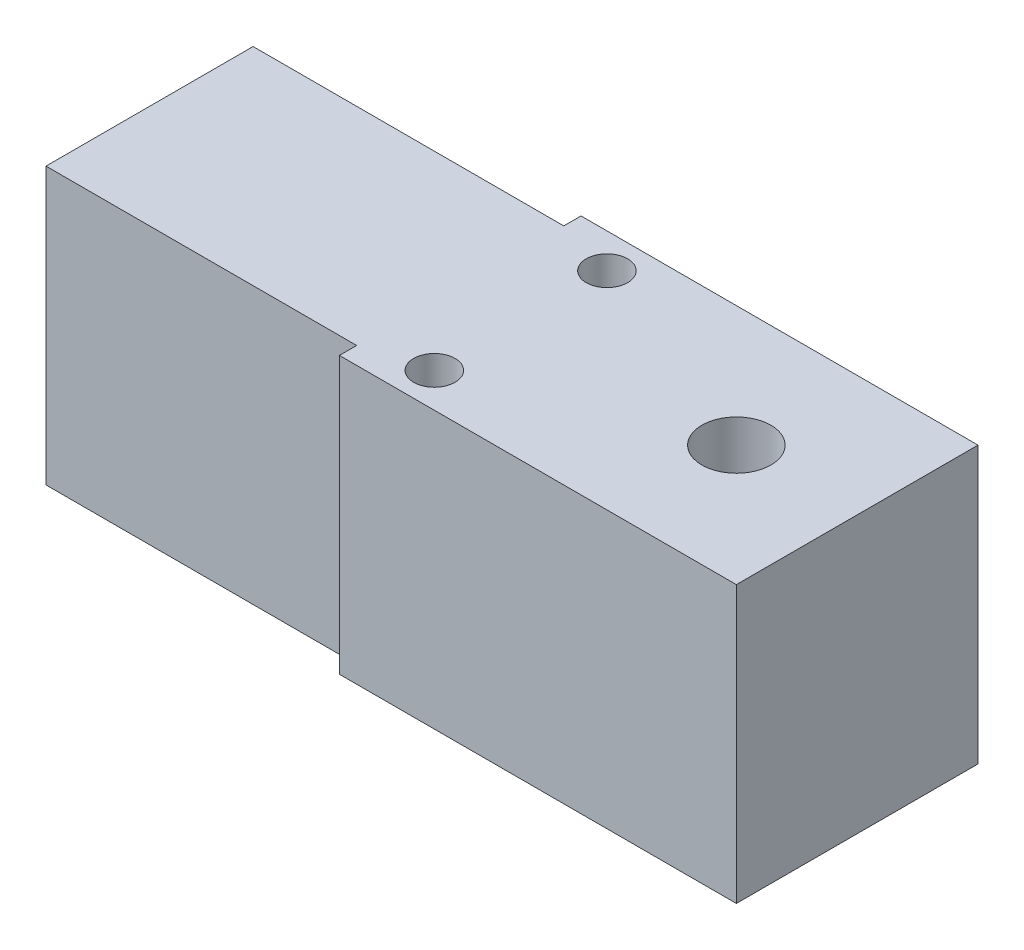
ISO-10303-21;
HEADER;
FILE_DESCRIPTION(('STEP AP214'),'2;1');
FILE_NAME('part.step','',(''),(''),'','','');
FILE_SCHEMA(('AUTOMOTIVE_DESIGN { 1 0 10303 214 1 1 1 1 }'));
ENDSEC;
DATA;
#1=APPLICATION_CONTEXT('core data for automotive mechanical design processes');
#2=APPLICATION_PROTOCOL_DEFINITION('international standard','automotive_design',2000,#1);
#3=PRODUCT_CONTEXT('',#1,'mechanical');
#4=PRODUCT('Part','Part','',(#3));
#5=PRODUCT_RELATED_PRODUCT_CATEGORY('part','',(#4));
#6=PRODUCT_DEFINITION_FORMATION('','',#4);
#7=PRODUCT_DEFINITION_CONTEXT('part definition',#1,'design');
#8=PRODUCT_DEFINITION('design','',#6,#7);
#9=PRODUCT_DEFINITION_SHAPE('','',#8);
#10=(LENGTH_UNIT() NAMED_UNIT(*) SI_UNIT(.MILLI.,.METRE.));
#11=(NAMED_UNIT(*) PLANE_ANGLE_UNIT() SI_UNIT($,.RADIAN.));
#12=(NAMED_UNIT(*) SI_UNIT($,.STERADIAN.) SOLID_ANGLE_UNIT());
#13=UNCERTAINTY_MEASURE_WITH_UNIT(LENGTH_MEASURE(1.E-05),#10,'distance_accuracy_value','');
#14=(GEOMETRIC_REPRESENTATION_CONTEXT(3) GLOBAL_UNCERTAINTY_ASSIGNED_CONTEXT((#13)) GLOBAL_UNIT_ASSIGNED_CONTEXT((#10,
#11,#12)) REPRESENTATION_CONTEXT('',''));
#15=CARTESIAN_POINT('',(0.,0.,0.));
#16=DIRECTION('',(0.,0.,1.));
#17=DIRECTION('',(1.,0.,0.));
#18=AXIS2_PLACEMENT_3D('',#15,#16,#17);
#19=CARTESIAN_POINT('',(0.,12.7,9.525));
#20=DIRECTION('',(0.,0.,-1.));
#21=DIRECTION('',(-1.,0.,0.));
#22=AXIS2_PLACEMENT_3D('',#19,#20,#21);
#23=PLANE('',#22);
#24=DIRECTION('',(1.,0.,0.));
#25=VECTOR('',#24,1.);
#26=CARTESIAN_POINT('',(0.,-12.7,9.525));
#27=LINE('',#26,#25);
#28=CARTESIAN_POINT('',(-28.575,-12.7,9.525));
#29=VERTEX_POINT('',#28);
#30=CARTESIAN_POINT('',(0.,-12.7,9.525));
#31=VERTEX_POINT('',#30);
#32=EDGE_CURVE('E142',#29,#31,#27,.T.);
#33=ORIENTED_EDGE('',*,*,#32,.T.);
#34=DIRECTION('',(0.,-1.,0.));
#35=VECTOR('',#34,1.);
#36=CARTESIAN_POINT('',(0.,12.7,9.525));
#37=LINE('',#36,#35);
#38=CARTESIAN_POINT('',(0.,12.7,9.525));
#39=VERTEX_POINT('',#38);
#40=EDGE_CURVE('E11',#39,#31,#37,.T.);
#41=ORIENTED_EDGE('',*,*,#40,.F.);
#42=DIRECTION('',(1.,0.,0.));
#43=VECTOR('',#42,1.);
#44=CARTESIAN_POINT('',(0.,12.7,9.525));
#45=LINE('',#44,#43);
#46=CARTESIAN_POINT('',(-28.575,12.7,9.525));
#47=VERTEX_POINT('',#46);
#48=EDGE_CURVE('E95',#47,#39,#45,.T.);
#49=ORIENTED_EDGE('',*,*,#48,.F.);
#50=DIRECTION('',(0.,-1.,0.));
#51=VECTOR('',#50,1.);
#52=CARTESIAN_POINT('',(-28.575,12.7,9.525));
#53=LINE('',#52,#51);
#54=EDGE_CURVE('E58',#47,#29,#53,.T.);
#55=ORIENTED_EDGE('',*,*,#54,.T.);
#56=EDGE_LOOP('',(#33,#41,#49,#55));
#57=FACE_BOUND('',#56,.T.);
#58=ADVANCED_FACE('F41',(#57),#23,.F.);
#59=CARTESIAN_POINT('',(0.,12.7,0.));
#60=DIRECTION('',(-1.,0.,0.));
#61=DIRECTION('',(0.,0.,1.));
#62=AXIS2_PLACEMENT_3D('',#59,#60,#61);
#63=PLANE('',#62);
#64=DIRECTION('',(0.,0.,-1.));
#65=VECTOR('',#64,1.);
#66=CARTESIAN_POINT('',(0.,-12.7,0.));
#67=LINE('',#66,#65);
#68=CARTESIAN_POINT('',(0.,-12.7,11.1125));
#69=VERTEX_POINT('',#68);
#70=EDGE_CURVE('E145',#69,#31,#67,.T.);
#71=ORIENTED_EDGE('',*,*,#70,.F.);
#72=DIRECTION('',(0.,-1.,0.));
#73=VECTOR('',#72,1.);
#74=CARTESIAN_POINT('',(0.,12.7,11.1125));
#75=LINE('',#74,#73);
#76=CARTESIAN_POINT('',(0.,12.7,11.1125));
#77=VERTEX_POINT('',#76);
#78=EDGE_CURVE('E50',#77,#69,#75,.T.);
#79=ORIENTED_EDGE('',*,*,#78,.F.);
#80=DIRECTION('',(0.,0.,-1.));
#81=VECTOR('',#80,1.);
#82=CARTESIAN_POINT('',(0.,12.7,0.));
#83=LINE('',#82,#81);
#84=EDGE_CURVE('E132',#77,#39,#83,.T.);
#85=ORIENTED_EDGE('',*,*,#84,.T.);
#86=ORIENTED_EDGE('',*,*,#40,.T.);
#87=EDGE_LOOP('',(#71,#79,#85,#86));
#88=FACE_BOUND('',#87,.T.);
#89=ADVANCED_FACE('F190',(#88),#63,.T.);
#90=CARTESIAN_POINT('',(0.,12.7,11.1125));
#91=DIRECTION('',(0.,0.,1.));
#92=DIRECTION('',(1.,0.,0.));
#93=AXIS2_PLACEMENT_3D('',#90,#91,#92);
#94=PLANE('',#93);
#95=DIRECTION('',(-1.,0.,0.));
#96=VECTOR('',#95,1.);
#97=CARTESIAN_POINT('',(0.,-12.7,11.1125));
#98=LINE('',#97,#96);
#99=CARTESIAN_POINT('',(36.5125,-12.7,11.1125));
#100=VERTEX_POINT('',#99);
#101=EDGE_CURVE('E150',#100,#69,#98,.T.);
#102=ORIENTED_EDGE('',*,*,#101,.F.);
#103=DIRECTION('',(0.,-1.,0.));
#104=VECTOR('',#103,1.);
#105=CARTESIAN_POINT('',(36.5125,12.7,11.1125));
#106=LINE('',#105,#104);
#107=CARTESIAN_POINT('',(36.5125,12.7,11.1125));
#108=VERTEX_POINT('',#107);
#109=EDGE_CURVE('E178',#108,#100,#106,.T.);
#110=ORIENTED_EDGE('',*,*,#109,.F.);
#111=DIRECTION('',(-1.,0.,0.));
#112=VECTOR('',#111,1.);
#113=CARTESIAN_POINT('',(0.,12.7,11.1125));
#114=LINE('',#113,#112);
#115=EDGE_CURVE('E187',#108,#77,#114,.T.);
#116=ORIENTED_EDGE('',*,*,#115,.T.);
#117=ORIENTED_EDGE('',*,*,#78,.T.);
#118=EDGE_LOOP('',(#102,#110,#116,#117));
#119=FACE_BOUND('',#118,.T.);
#120=ADVANCED_FACE('F185',(#119),#94,.T.);
#121=CARTESIAN_POINT('',(36.5125,12.7,0.));
#122=DIRECTION('',(-1.,0.,0.));
#123=DIRECTION('',(0.,0.,1.));
#124=AXIS2_PLACEMENT_3D('',#121,#122,#123);
#125=PLANE('',#124);
#126=DIRECTION('',(0.,0.,-1.));
#127=VECTOR('',#126,1.);
#128=CARTESIAN_POINT('',(36.5125,-12.7,0.));
#129=LINE('',#128,#127);
#130=CARTESIAN_POINT('',(36.5125,-12.7,-11.1125));
#131=VERTEX_POINT('',#130);
#132=EDGE_CURVE('E154',#100,#131,#129,.T.);
#133=ORIENTED_EDGE('',*,*,#132,.T.);
#134=DIRECTION('',(0.,-1.,0.));
#135=VECTOR('',#134,1.);
#136=CARTESIAN_POINT('',(36.5125,12.7,-11.1125));
#137=LINE('',#136,#135);
#138=CARTESIAN_POINT('',(36.5125,12.7,-11.1125));
#139=VERTEX_POINT('',#138);
#140=EDGE_CURVE('E174',#139,#131,#137,.T.);
#141=ORIENTED_EDGE('',*,*,#140,.F.);
#142=DIRECTION('',(0.,0.,-1.));
#143=VECTOR('',#142,1.);
#144=CARTESIAN_POINT('',(36.5125,12.7,0.));
#145=LINE('',#144,#143);
#146=EDGE_CURVE('E202',#108,#139,#145,.T.);
#147=ORIENTED_EDGE('',*,*,#146,.F.);
#148=ORIENTED_EDGE('',*,*,#109,.T.);
#149=EDGE_LOOP('',(#133,#141,#147,#148));
#150=FACE_BOUND('',#149,.T.);
#151=ADVANCED_FACE('F197',(#150),#125,.F.);
#152=CARTESIAN_POINT('',(0.,12.7,-11.1125));
#153=DIRECTION('',(0.,0.,1.));
#154=DIRECTION('',(1.,0.,0.));
#155=AXIS2_PLACEMENT_3D('',#152,#153,#154);
#156=PLANE('',#155);
#157=DIRECTION('',(-1.,0.,0.));
#158=VECTOR('',#157,1.);
#159=CARTESIAN_POINT('',(0.,-12.7,-11.1125));
#160=LINE('',#159,#158);
#161=CARTESIAN_POINT('',(0.,-12.7,-11.1125));
#162=VERTEX_POINT('',#161);
#163=EDGE_CURVE('E157',#131,#162,#160,.T.);
#164=ORIENTED_EDGE('',*,*,#163,.T.);
#165=DIRECTION('',(0.,-1.,0.));
#166=VECTOR('',#165,1.);
#167=CARTESIAN_POINT('',(0.,12.7,-11.1125));
#168=LINE('',#167,#166);
#169=CARTESIAN_POINT('',(0.,12.7,-11.1125));
#170=VERTEX_POINT('',#169);
#171=EDGE_CURVE('E122',#170,#162,#168,.T.);
#172=ORIENTED_EDGE('',*,*,#171,.F.);
#173=DIRECTION('',(-1.,0.,0.));
#174=VECTOR('',#173,1.);
#175=CARTESIAN_POINT('',(0.,12.7,-11.1125));
#176=LINE('',#175,#174);
#177=EDGE_CURVE('E128',#139,#170,#176,.T.);
#178=ORIENTED_EDGE('',*,*,#177,.F.);
#179=ORIENTED_EDGE('',*,*,#140,.T.);
#180=EDGE_LOOP('',(#164,#172,#178,#179));
#181=FACE_BOUND('',#180,.T.);
#182=ADVANCED_FACE('F200',(#181),#156,.F.);
#183=CARTESIAN_POINT('',(0.,-12.7,-9.525));
#184=VERTEX_POINT('',#183);
#185=EDGE_CURVE('E117',#184,#162,#67,.T.);
#186=ORIENTED_EDGE('',*,*,#185,.F.);
#187=DIRECTION('',(0.,-1.,0.));
#188=VECTOR('',#187,1.);
#189=CARTESIAN_POINT('',(0.,12.7,-9.525));
#190=LINE('',#189,#188);
#191=CARTESIAN_POINT('',(0.,12.7,-9.525));
#192=VERTEX_POINT('',#191);
#193=EDGE_CURVE('E112',#192,#184,#190,.T.);
#194=ORIENTED_EDGE('',*,*,#193,.F.);
#195=EDGE_CURVE('E115',#192,#170,#83,.T.);
#196=ORIENTED_EDGE('',*,*,#195,.T.);
#197=ORIENTED_EDGE('',*,*,#171,.T.);
#198=EDGE_LOOP('',(#186,#194,#196,#197));
#199=FACE_BOUND('',#198,.T.);
#200=ADVANCED_FACE('F114',(#199),#63,.T.);
#201=CARTESIAN_POINT('',(0.,12.7,-9.525));
#202=DIRECTION('',(0.,0.,-1.));
#203=DIRECTION('',(-1.,0.,0.));
#204=AXIS2_PLACEMENT_3D('',#201,#202,#203);
#205=PLANE('',#204);
#206=DIRECTION('',(1.,0.,0.));
#207=VECTOR('',#206,1.);
#208=CARTESIAN_POINT('',(0.,-12.7,-9.525));
#209=LINE('',#208,#207);
#210=CARTESIAN_POINT('',(-28.575,-12.7,-9.525));
#211=VERTEX_POINT('',#210);
#212=EDGE_CURVE('E161',#211,#184,#209,.T.);
#213=ORIENTED_EDGE('',*,*,#212,.F.);
#214=DIRECTION('',(0.,-1.,0.));
#215=VECTOR('',#214,1.);
#216=CARTESIAN_POINT('',(-28.575,12.7,-9.525));
#217=LINE('',#216,#215);
#218=CARTESIAN_POINT('',(-28.575,12.7,-9.525));
#219=VERTEX_POINT('',#218);
#220=EDGE_CURVE('E83',#219,#211,#217,.T.);
#221=ORIENTED_EDGE('',*,*,#220,.F.);
#222=DIRECTION('',(1.,0.,0.));
#223=VECTOR('',#222,1.);
#224=CARTESIAN_POINT('',(0.,12.7,-9.525));
#225=LINE('',#224,#223);
#226=EDGE_CURVE('E126',#219,#192,#225,.T.);
#227=ORIENTED_EDGE('',*,*,#226,.T.);
#228=ORIENTED_EDGE('',*,*,#193,.T.);
#229=EDGE_LOOP('',(#213,#221,#227,#228));
#230=FACE_BOUND('',#229,.T.);
#231=ADVANCED_FACE('F133',(#230),#205,.T.);
#232=CARTESIAN_POINT('',(-28.575,12.7,0.));
#233=DIRECTION('',(-1.,0.,0.));
#234=DIRECTION('',(0.,0.,1.));
#235=AXIS2_PLACEMENT_3D('',#232,#233,#234);
#236=PLANE('',#235);
#237=DIRECTION('',(0.,0.,-1.));
#238=VECTOR('',#237,1.);
#239=CARTESIAN_POINT('',(-28.575,-12.7,0.));
#240=LINE('',#239,#238);
#241=EDGE_CURVE('E164',#29,#211,#240,.T.);
#242=ORIENTED_EDGE('',*,*,#241,.F.);
#243=ORIENTED_EDGE('',*,*,#54,.F.);
#244=DIRECTION('',(0.,0.,-1.));
#245=VECTOR('',#244,1.);
#246=CARTESIAN_POINT('',(-28.575,12.7,0.));
#247=LINE('',#246,#245);
#248=EDGE_CURVE('E135',#47,#219,#247,.T.);
#249=ORIENTED_EDGE('',*,*,#248,.T.);
#250=ORIENTED_EDGE('',*,*,#220,.T.);
#251=EDGE_LOOP('',(#242,#243,#249,#250));
#252=FACE_BOUND('',#251,.T.);
#253=ADVANCED_FACE('F260',(#252),#236,.T.);
#254=CARTESIAN_POINT('',(0.,12.7,0.));
#255=DIRECTION('',(0.,1.,0.));
#256=DIRECTION('',(0.,0.,1.));
#257=AXIS2_PLACEMENT_3D('',#254,#255,#256);
#258=PLANE('',#257);
#259=CARTESIAN_POINT('',(25.4,12.7,0.));
#260=DIRECTION('',(0.,-1.,0.));
#261=DIRECTION('',(0.,0.,-1.));
#262=AXIS2_PLACEMENT_3D('',#259,#260,#261);
#263=CIRCLE('',#262,3.17500000000001);
#264=CARTESIAN_POINT('',(25.4,12.7,-3.17500000000001));
#265=VERTEX_POINT('',#264);
#266=EDGE_CURVE('E215',#265,#265,#263,.T.);
#267=ORIENTED_EDGE('',*,*,#266,.T.);
#268=EDGE_LOOP('',(#267));
#269=FACE_BOUND('',#268,.T.);
#270=CARTESIAN_POINT('',(5.55625,12.7,7.9375));
#271=DIRECTION('',(0.,-1.,0.));
#272=DIRECTION('',(0.,0.,-1.));
#273=AXIS2_PLACEMENT_3D('',#270,#271,#272);
#274=CIRCLE('',#273,1.905);
#275=CARTESIAN_POINT('',(5.55625,12.7,6.0325));
#276=VERTEX_POINT('',#275);
#277=EDGE_CURVE('E146',#276,#276,#274,.T.);
#278=ORIENTED_EDGE('',*,*,#277,.T.);
#279=EDGE_LOOP('',(#278));
#280=FACE_BOUND('',#279,.T.);
#281=CARTESIAN_POINT('',(5.55625,12.7,-7.9375));
#282=DIRECTION('',(0.,-1.,0.));
#283=DIRECTION('',(0.,0.,-1.));
#284=AXIS2_PLACEMENT_3D('',#281,#282,#283);
#285=CIRCLE('',#284,1.905);
#286=CARTESIAN_POINT('',(5.55625,12.7,-9.8425));
#287=VERTEX_POINT('',#286);
#288=EDGE_CURVE('E214',#287,#287,#285,.T.);
#289=ORIENTED_EDGE('',*,*,#288,.T.);
#290=EDGE_LOOP('',(#289));
#291=FACE_BOUND('',#290,.T.);
#292=ORIENTED_EDGE('',*,*,#48,.T.);
#293=ORIENTED_EDGE('',*,*,#84,.F.);
#294=ORIENTED_EDGE('',*,*,#115,.F.);
#295=ORIENTED_EDGE('',*,*,#146,.T.);
#296=ORIENTED_EDGE('',*,*,#177,.T.);
#297=ORIENTED_EDGE('',*,*,#195,.F.);
#298=ORIENTED_EDGE('',*,*,#226,.F.);
#299=ORIENTED_EDGE('',*,*,#248,.F.);
#300=EDGE_LOOP('',(#292,#293,#294,#295,#296,#297,#298,#299));
#301=FACE_BOUND('',#300,.T.);
#302=ADVANCED_FACE('F125',(#269,#280,#291,#301),#258,.T.);
#303=CARTESIAN_POINT('',(0.,-12.7,0.));
#304=DIRECTION('',(0.,1.,0.));
#305=DIRECTION('',(0.,0.,1.));
#306=AXIS2_PLACEMENT_3D('',#303,#304,#305);
#307=PLANE('',#306);
#308=CARTESIAN_POINT('',(25.4,-12.7,0.));
#309=DIRECTION('',(0.,-1.,0.));
#310=DIRECTION('',(0.,0.,-1.));
#311=AXIS2_PLACEMENT_3D('',#308,#309,#310);
#312=CIRCLE('',#311,3.17500000000001);
#313=CARTESIAN_POINT('',(25.4,-12.7,-3.17500000000001));
#314=VERTEX_POINT('',#313);
#315=EDGE_CURVE('E229',#314,#314,#312,.T.);
#316=ORIENTED_EDGE('',*,*,#315,.F.);
#317=EDGE_LOOP('',(#316));
#318=FACE_BOUND('',#317,.T.);
#319=CARTESIAN_POINT('',(5.55625,-12.7,7.9375));
#320=DIRECTION('',(0.,-1.,0.));
#321=DIRECTION('',(0.,0.,-1.));
#322=AXIS2_PLACEMENT_3D('',#319,#320,#321);
#323=CIRCLE('',#322,1.905);
#324=CARTESIAN_POINT('',(5.55625,-12.7,6.0325));
#325=VERTEX_POINT('',#324);
#326=EDGE_CURVE('E219',#325,#325,#323,.T.);
#327=ORIENTED_EDGE('',*,*,#326,.F.);
#328=EDGE_LOOP('',(#327));
#329=FACE_BOUND('',#328,.T.);
#330=CARTESIAN_POINT('',(5.55625,-12.7,-7.9375));
#331=DIRECTION('',(0.,-1.,0.));
#332=DIRECTION('',(0.,0.,-1.));
#333=AXIS2_PLACEMENT_3D('',#330,#331,#332);
#334=CIRCLE('',#333,1.905);
#335=CARTESIAN_POINT('',(5.55625,-12.7,-9.8425));
#336=VERTEX_POINT('',#335);
#337=EDGE_CURVE('E210',#336,#336,#334,.T.);
#338=ORIENTED_EDGE('',*,*,#337,.F.);
#339=EDGE_LOOP('',(#338));
#340=FACE_BOUND('',#339,.T.);
#341=ORIENTED_EDGE('',*,*,#32,.F.);
#342=ORIENTED_EDGE('',*,*,#241,.T.);
#343=ORIENTED_EDGE('',*,*,#212,.T.);
#344=ORIENTED_EDGE('',*,*,#185,.T.);
#345=ORIENTED_EDGE('',*,*,#163,.F.);
#346=ORIENTED_EDGE('',*,*,#132,.F.);
#347=ORIENTED_EDGE('',*,*,#101,.T.);
#348=ORIENTED_EDGE('',*,*,#70,.T.);
#349=EDGE_LOOP('',(#341,#342,#343,#344,#345,#346,#347,#348));
#350=FACE_BOUND('',#349,.T.);
#351=ADVANCED_FACE('F193',(#318,#329,#340,#350),#307,.F.);
#352=CARTESIAN_POINT('',(5.55625,12.7,-7.9375));
#353=DIRECTION('',(0.,-1.,0.));
#354=DIRECTION('',(0.,0.,-1.));
#355=AXIS2_PLACEMENT_3D('',#352,#353,#354);
#356=CYLINDRICAL_SURFACE('',#355,1.905);
#357=ORIENTED_EDGE('',*,*,#288,.F.);
#358=EDGE_LOOP('',(#357));
#359=FACE_BOUND('',#358,.T.);
#360=ORIENTED_EDGE('',*,*,#337,.T.);
#361=EDGE_LOOP('',(#360));
#362=FACE_BOUND('',#361,.T.);
#363=ADVANCED_FACE('F238',(#359,#362),#356,.F.);
#364=CARTESIAN_POINT('',(5.55625,12.7,7.9375));
#365=DIRECTION('',(0.,-1.,0.));
#366=DIRECTION('',(0.,0.,-1.));
#367=AXIS2_PLACEMENT_3D('',#364,#365,#366);
#368=CYLINDRICAL_SURFACE('',#367,1.905);
#369=ORIENTED_EDGE('',*,*,#277,.F.);
#370=EDGE_LOOP('',(#369));
#371=FACE_BOUND('',#370,.T.);
#372=ORIENTED_EDGE('',*,*,#326,.T.);
#373=EDGE_LOOP('',(#372));
#374=FACE_BOUND('',#373,.T.);
#375=ADVANCED_FACE('F245',(#371,#374),#368,.F.);
#376=CARTESIAN_POINT('',(25.4,12.7,0.));
#377=DIRECTION('',(0.,-1.,0.));
#378=DIRECTION('',(0.,0.,-1.));
#379=AXIS2_PLACEMENT_3D('',#376,#377,#378);
#380=CYLINDRICAL_SURFACE('',#379,3.17500000000001);
#381=ORIENTED_EDGE('',*,*,#266,.F.);
#382=EDGE_LOOP('',(#381));
#383=FACE_BOUND('',#382,.T.);
#384=ORIENTED_EDGE('',*,*,#315,.T.);
#385=EDGE_LOOP('',(#384));
#386=FACE_BOUND('',#385,.T.);
#387=ADVANCED_FACE('F234',(#383,#386),#380,.F.);
#388=CLOSED_SHELL('',(#58,#89,#120,#151,#182,#200,#231,#253,#302,#351,#363,#375,#387));
#389=MANIFOLD_SOLID_BREP('B2',#388);
#390=ADVANCED_BREP_SHAPE_REPRESENTATION('',(#18,#389),#14);
#391=SHAPE_DEFINITION_REPRESENTATION(#9,#390);
ENDSEC;
END-ISO-10303-21;
